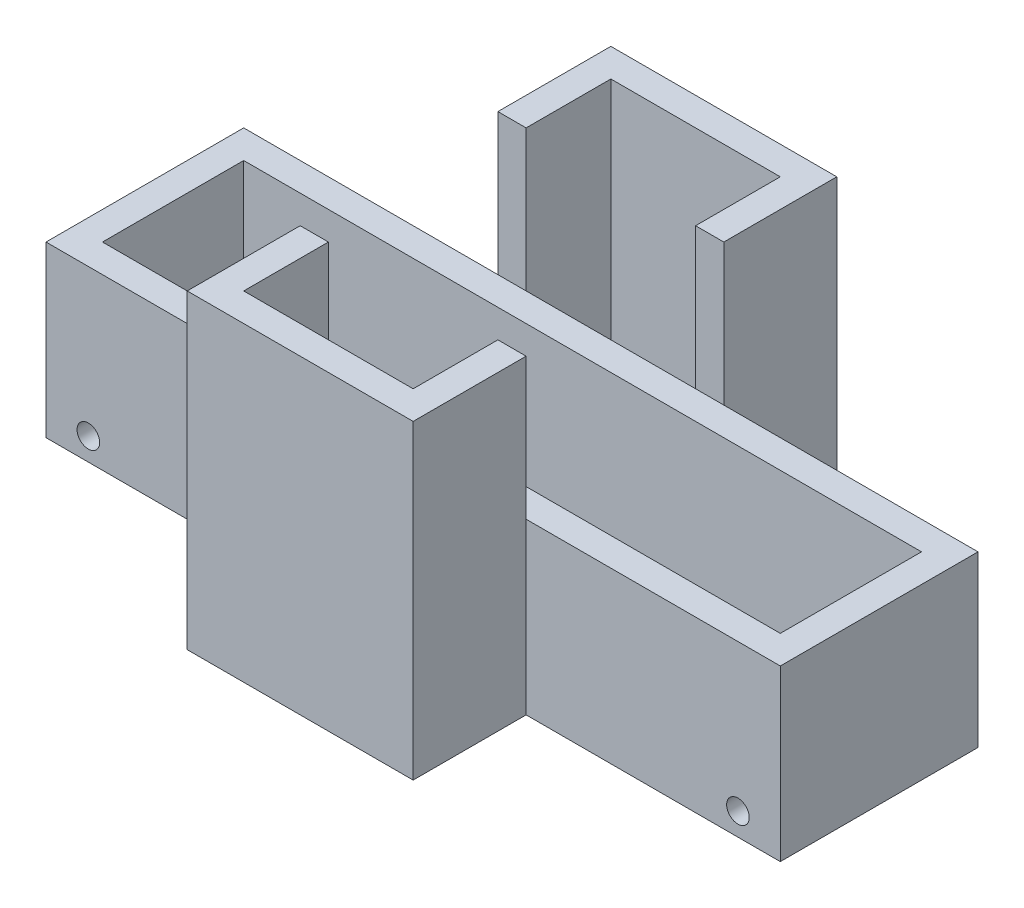
ISO-10303-21;
HEADER;
FILE_DESCRIPTION(('STEP AP214'),'2;1');
FILE_NAME('part.step','',(''),(''),'','','');
FILE_SCHEMA(('AUTOMOTIVE_DESIGN { 1 0 10303 214 1 1 1 1 }'));
ENDSEC;
DATA;
#1=APPLICATION_CONTEXT('core data for automotive mechanical design processes');
#2=APPLICATION_PROTOCOL_DEFINITION('international standard','automotive_design',2000,#1);
#3=PRODUCT_CONTEXT('',#1,'mechanical');
#4=PRODUCT('Part','Part','',(#3));
#5=PRODUCT_RELATED_PRODUCT_CATEGORY('part','',(#4));
#6=PRODUCT_DEFINITION_FORMATION('','',#4);
#7=PRODUCT_DEFINITION_CONTEXT('part definition',#1,'design');
#8=PRODUCT_DEFINITION('design','',#6,#7);
#9=PRODUCT_DEFINITION_SHAPE('','',#8);
#10=(LENGTH_UNIT() NAMED_UNIT(*) SI_UNIT(.MILLI.,.METRE.));
#11=(NAMED_UNIT(*) PLANE_ANGLE_UNIT() SI_UNIT($,.RADIAN.));
#12=(NAMED_UNIT(*) SI_UNIT($,.STERADIAN.) SOLID_ANGLE_UNIT());
#13=UNCERTAINTY_MEASURE_WITH_UNIT(LENGTH_MEASURE(1.E-05),#10,'distance_accuracy_value','');
#14=(GEOMETRIC_REPRESENTATION_CONTEXT(3) GLOBAL_UNCERTAINTY_ASSIGNED_CONTEXT((#13)) GLOBAL_UNIT_ASSIGNED_CONTEXT((#10,
#11,#12)) REPRESENTATION_CONTEXT('',''));
#15=CARTESIAN_POINT('',(0.,0.,0.));
#16=DIRECTION('',(0.,0.,1.));
#17=DIRECTION('',(1.,0.,0.));
#18=AXIS2_PLACEMENT_3D('',#15,#16,#17);
#19=CARTESIAN_POINT('',(0.,0.,17.5));
#20=DIRECTION('',(0.,0.,-1.));
#21=DIRECTION('',(-1.,0.,0.));
#22=AXIS2_PLACEMENT_3D('',#19,#20,#21);
#23=PLANE('',#22);
#24=DIRECTION('',(0.,1.,0.));
#25=VECTOR('',#24,1.);
#26=CARTESIAN_POINT('',(-15.,5.,17.5));
#27=LINE('',#26,#25);
#28=CARTESIAN_POINT('',(-15.,30.,17.5));
#29=VERTEX_POINT('',#28);
#30=CARTESIAN_POINT('',(-15.,55.,17.5));
#31=VERTEX_POINT('',#30);
#32=EDGE_CURVE('E283',#29,#31,#27,.T.);
#33=ORIENTED_EDGE('',*,*,#32,.F.);
#34=DIRECTION('',(1.,0.,0.));
#35=VECTOR('',#34,1.);
#36=CARTESIAN_POINT('',(-65.,30.,17.5));
#37=LINE('',#36,#35);
#38=CARTESIAN_POINT('',(-20.,30.,17.5));
#39=VERTEX_POINT('',#38);
#40=EDGE_CURVE('E463',#39,#29,#37,.T.);
#41=ORIENTED_EDGE('',*,*,#40,.F.);
#42=DIRECTION('',(0.,-1.,0.));
#43=VECTOR('',#42,1.);
#44=CARTESIAN_POINT('',(-20.,0.,17.5));
#45=LINE('',#44,#43);
#46=CARTESIAN_POINT('',(-20.,55.,17.5));
#47=VERTEX_POINT('',#46);
#48=EDGE_CURVE('E50',#47,#39,#45,.T.);
#49=ORIENTED_EDGE('',*,*,#48,.F.);
#50=DIRECTION('',(-1.,0.,0.));
#51=VECTOR('',#50,1.);
#52=CARTESIAN_POINT('',(-20.,55.,17.5));
#53=LINE('',#52,#51);
#54=EDGE_CURVE('E306',#31,#47,#53,.T.);
#55=ORIENTED_EDGE('',*,*,#54,.F.);
#56=EDGE_LOOP('',(#33,#41,#49,#55));
#57=FACE_BOUND('',#56,.T.);
#58=ADVANCED_FACE('F39',(#57),#23,.T.);
#59=CARTESIAN_POINT('',(-65.,30.,17.5));
#60=DIRECTION('',(0.,0.,-1.));
#61=DIRECTION('',(-1.,0.,0.));
#62=AXIS2_PLACEMENT_3D('',#59,#60,#61);
#63=PLANE('',#62);
#64=CARTESIAN_POINT('',(-57.5,4.,17.5));
#65=DIRECTION('',(0.,0.,1.));
#66=DIRECTION('',(1.,0.,0.));
#67=AXIS2_PLACEMENT_3D('',#64,#65,#66);
#68=CIRCLE('',#67,2.);
#69=CARTESIAN_POINT('',(-55.5,4.,17.5));
#70=VERTEX_POINT('',#69);
#71=EDGE_CURVE('E398',#70,#70,#68,.T.);
#72=ORIENTED_EDGE('',*,*,#71,.F.);
#73=EDGE_LOOP('',(#72));
#74=FACE_BOUND('',#73,.T.);
#75=CARTESIAN_POINT('',(-20.,0.,17.5));
#76=VERTEX_POINT('',#75);
#77=EDGE_CURVE('E11',#39,#76,#45,.T.);
#78=ORIENTED_EDGE('',*,*,#77,.F.);
#79=CARTESIAN_POINT('',(-65.,30.,17.5));
#80=VERTEX_POINT('',#79);
#81=EDGE_CURVE('E460',#80,#39,#37,.T.);
#82=ORIENTED_EDGE('',*,*,#81,.F.);
#83=DIRECTION('',(0.,-1.,0.));
#84=VECTOR('',#83,1.);
#85=CARTESIAN_POINT('',(-65.,30.,17.5));
#86=LINE('',#85,#84);
#87=CARTESIAN_POINT('',(-65.,0.,17.5));
#88=VERTEX_POINT('',#87);
#89=EDGE_CURVE('E476',#80,#88,#86,.T.);
#90=ORIENTED_EDGE('',*,*,#89,.T.);
#91=DIRECTION('',(1.,0.,0.));
#92=VECTOR('',#91,1.);
#93=CARTESIAN_POINT('',(-65.,0.,17.5));
#94=LINE('',#93,#92);
#95=EDGE_CURVE('E451',#88,#76,#94,.T.);
#96=ORIENTED_EDGE('',*,*,#95,.T.);
#97=EDGE_LOOP('',(#78,#82,#90,#96));
#98=FACE_BOUND('',#97,.T.);
#99=ADVANCED_FACE('F532',(#74,#98),#63,.F.);
#100=CARTESIAN_POINT('',(57.5,4.,17.5));
#101=DIRECTION('',(0.,0.,-1.));
#102=DIRECTION('',(-1.,0.,0.));
#103=AXIS2_PLACEMENT_3D('',#100,#101,#102);
#104=CIRCLE('',#103,2.);
#105=CARTESIAN_POINT('',(55.5,4.,17.5));
#106=VERTEX_POINT('',#105);
#107=EDGE_CURVE('E387',#106,#106,#104,.T.);
#108=ORIENTED_EDGE('',*,*,#107,.T.);
#109=EDGE_LOOP('',(#108));
#110=FACE_BOUND('',#109,.T.);
#111=DIRECTION('',(0.,1.,0.));
#112=VECTOR('',#111,1.);
#113=CARTESIAN_POINT('',(20.,0.,17.5));
#114=LINE('',#113,#112);
#115=CARTESIAN_POINT('',(20.,0.,17.5));
#116=VERTEX_POINT('',#115);
#117=CARTESIAN_POINT('',(20.,30.,17.5));
#118=VERTEX_POINT('',#117);
#119=EDGE_CURVE('E303',#116,#118,#114,.T.);
#120=ORIENTED_EDGE('',*,*,#119,.F.);
#121=CARTESIAN_POINT('',(65.,0.,17.5));
#122=VERTEX_POINT('',#121);
#123=EDGE_CURVE('E472',#116,#122,#94,.T.);
#124=ORIENTED_EDGE('',*,*,#123,.T.);
#125=DIRECTION('',(0.,-1.,0.));
#126=VECTOR('',#125,1.);
#127=CARTESIAN_POINT('',(65.,30.,17.5));
#128=LINE('',#127,#126);
#129=CARTESIAN_POINT('',(65.,30.,17.5));
#130=VERTEX_POINT('',#129);
#131=EDGE_CURVE('E462',#130,#122,#128,.T.);
#132=ORIENTED_EDGE('',*,*,#131,.F.);
#133=EDGE_CURVE('E459',#118,#130,#37,.T.);
#134=ORIENTED_EDGE('',*,*,#133,.F.);
#135=EDGE_LOOP('',(#120,#124,#132,#134));
#136=FACE_BOUND('',#135,.T.);
#137=ADVANCED_FACE('F577',(#110,#136),#63,.F.);
#138=CARTESIAN_POINT('',(0.,0.,-17.5));
#139=DIRECTION('',(0.,0.,1.));
#140=DIRECTION('',(1.,0.,0.));
#141=AXIS2_PLACEMENT_3D('',#138,#139,#140);
#142=PLANE('',#141);
#143=DIRECTION('',(0.,1.,0.));
#144=VECTOR('',#143,1.);
#145=CARTESIAN_POINT('',(-15.,5.,-17.5));
#146=LINE('',#145,#144);
#147=CARTESIAN_POINT('',(-15.,30.,-17.5));
#148=VERTEX_POINT('',#147);
#149=CARTESIAN_POINT('',(-15.,55.,-17.5));
#150=VERTEX_POINT('',#149);
#151=EDGE_CURVE('E334',#148,#150,#146,.T.);
#152=ORIENTED_EDGE('',*,*,#151,.T.);
#153=DIRECTION('',(1.,0.,0.));
#154=VECTOR('',#153,1.);
#155=CARTESIAN_POINT('',(20.,55.,-17.5));
#156=LINE('',#155,#154);
#157=CARTESIAN_POINT('',(-20.,55.,-17.5));
#158=VERTEX_POINT('',#157);
#159=EDGE_CURVE('E359',#158,#150,#156,.T.);
#160=ORIENTED_EDGE('',*,*,#159,.F.);
#161=DIRECTION('',(0.,1.,0.));
#162=VECTOR('',#161,1.);
#163=CARTESIAN_POINT('',(-20.,0.,-17.5));
#164=LINE('',#163,#162);
#165=CARTESIAN_POINT('',(-20.,30.,-17.5));
#166=VERTEX_POINT('',#165);
#167=EDGE_CURVE('E368',#166,#158,#164,.T.);
#168=ORIENTED_EDGE('',*,*,#167,.F.);
#169=DIRECTION('',(-1.,0.,0.));
#170=VECTOR('',#169,1.);
#171=CARTESIAN_POINT('',(-65.,30.,-17.5));
#172=LINE('',#171,#170);
#173=EDGE_CURVE('E457',#148,#166,#172,.T.);
#174=ORIENTED_EDGE('',*,*,#173,.F.);
#175=EDGE_LOOP('',(#152,#160,#168,#174));
#176=FACE_BOUND('',#175,.T.);
#177=ADVANCED_FACE('F619',(#176),#142,.T.);
#178=CARTESIAN_POINT('',(-65.,30.,-17.5));
#179=DIRECTION('',(0.,0.,1.));
#180=DIRECTION('',(1.,0.,0.));
#181=AXIS2_PLACEMENT_3D('',#178,#179,#180);
#182=PLANE('',#181);
#183=CARTESIAN_POINT('',(57.5,4.,-17.5));
#184=DIRECTION('',(0.,0.,-1.));
#185=DIRECTION('',(-1.,0.,0.));
#186=AXIS2_PLACEMENT_3D('',#183,#184,#185);
#187=CIRCLE('',#186,2.);
#188=CARTESIAN_POINT('',(55.5,4.,-17.5));
#189=VERTEX_POINT('',#188);
#190=EDGE_CURVE('E386',#189,#189,#187,.T.);
#191=ORIENTED_EDGE('',*,*,#190,.F.);
#192=EDGE_LOOP('',(#191));
#193=FACE_BOUND('',#192,.T.);
#194=DIRECTION('',(0.,-1.,0.));
#195=VECTOR('',#194,1.);
#196=CARTESIAN_POINT('',(20.,0.,-17.5));
#197=LINE('',#196,#195);
#198=CARTESIAN_POINT('',(20.,30.,-17.5));
#199=VERTEX_POINT('',#198);
#200=CARTESIAN_POINT('',(20.,0.,-17.5));
#201=VERTEX_POINT('',#200);
#202=EDGE_CURVE('E48',#199,#201,#197,.T.);
#203=ORIENTED_EDGE('',*,*,#202,.F.);
#204=CARTESIAN_POINT('',(65.,30.,-17.5));
#205=VERTEX_POINT('',#204);
#206=EDGE_CURVE('E452',#205,#199,#172,.T.);
#207=ORIENTED_EDGE('',*,*,#206,.F.);
#208=DIRECTION('',(0.,-1.,0.));
#209=VECTOR('',#208,1.);
#210=CARTESIAN_POINT('',(65.,30.,-17.5));
#211=LINE('',#210,#209);
#212=CARTESIAN_POINT('',(65.,0.,-17.5));
#213=VERTEX_POINT('',#212);
#214=EDGE_CURVE('E482',#205,#213,#211,.T.);
#215=ORIENTED_EDGE('',*,*,#214,.T.);
#216=DIRECTION('',(-1.,0.,0.));
#217=VECTOR('',#216,1.);
#218=CARTESIAN_POINT('',(-65.,0.,-17.5));
#219=LINE('',#218,#217);
#220=EDGE_CURVE('E468',#213,#201,#219,.T.);
#221=ORIENTED_EDGE('',*,*,#220,.T.);
#222=EDGE_LOOP('',(#203,#207,#215,#221));
#223=FACE_BOUND('',#222,.T.);
#224=ADVANCED_FACE('F661',(#193,#223),#182,.F.);
#225=CARTESIAN_POINT('',(-57.5,4.,-17.5));
#226=DIRECTION('',(0.,0.,1.));
#227=DIRECTION('',(1.,0.,0.));
#228=AXIS2_PLACEMENT_3D('',#225,#226,#227);
#229=CIRCLE('',#228,2.);
#230=CARTESIAN_POINT('',(-55.5,4.,-17.5));
#231=VERTEX_POINT('',#230);
#232=EDGE_CURVE('E399',#231,#231,#229,.T.);
#233=ORIENTED_EDGE('',*,*,#232,.T.);
#234=EDGE_LOOP('',(#233));
#235=FACE_BOUND('',#234,.T.);
#236=CARTESIAN_POINT('',(-20.,0.,-17.5));
#237=VERTEX_POINT('',#236);
#238=EDGE_CURVE('E369',#237,#166,#164,.T.);
#239=ORIENTED_EDGE('',*,*,#238,.F.);
#240=CARTESIAN_POINT('',(-65.,0.,-17.5));
#241=VERTEX_POINT('',#240);
#242=EDGE_CURVE('E467',#237,#241,#219,.T.);
#243=ORIENTED_EDGE('',*,*,#242,.T.);
#244=DIRECTION('',(0.,-1.,0.));
#245=VECTOR('',#244,1.);
#246=CARTESIAN_POINT('',(-65.,30.,-17.5));
#247=LINE('',#246,#245);
#248=CARTESIAN_POINT('',(-65.,30.,-17.5));
#249=VERTEX_POINT('',#248);
#250=EDGE_CURVE('E479',#249,#241,#247,.T.);
#251=ORIENTED_EDGE('',*,*,#250,.F.);
#252=EDGE_CURVE('E450',#166,#249,#172,.T.);
#253=ORIENTED_EDGE('',*,*,#252,.F.);
#254=EDGE_LOOP('',(#239,#243,#251,#253));
#255=FACE_BOUND('',#254,.T.);
#256=ADVANCED_FACE('F527',(#235,#255),#182,.F.);
#257=CARTESIAN_POINT('',(0.,5.,0.));
#258=DIRECTION('',(0.,1.,0.));
#259=DIRECTION('',(0.,0.,1.));
#260=AXIS2_PLACEMENT_3D('',#257,#258,#259);
#261=PLANE('',#260);
#262=DIRECTION('',(0.,0.,-1.));
#263=VECTOR('',#262,1.);
#264=CARTESIAN_POINT('',(59.2320508075689,5.,17.5));
#265=LINE('',#264,#263);
#266=CARTESIAN_POINT('',(59.2320508075689,5.,12.5));
#267=VERTEX_POINT('',#266);
#268=CARTESIAN_POINT('',(59.2320508075689,5.,-12.5));
#269=VERTEX_POINT('',#268);
#270=EDGE_CURVE('E43',#267,#269,#265,.T.);
#271=ORIENTED_EDGE('',*,*,#270,.F.);
#272=DIRECTION('',(1.,0.,0.));
#273=VECTOR('',#272,1.);
#274=CARTESIAN_POINT('',(-60.,5.,12.5));
#275=LINE('',#274,#273);
#276=CARTESIAN_POINT('',(60.,5.,12.5));
#277=VERTEX_POINT('',#276);
#278=EDGE_CURVE('E423',#267,#277,#275,.T.);
#279=ORIENTED_EDGE('',*,*,#278,.T.);
#280=DIRECTION('',(0.,0.,-1.));
#281=VECTOR('',#280,1.);
#282=CARTESIAN_POINT('',(60.,5.,-12.5));
#283=LINE('',#282,#281);
#284=CARTESIAN_POINT('',(60.,5.,-12.5));
#285=VERTEX_POINT('',#284);
#286=EDGE_CURVE('E411',#277,#285,#283,.T.);
#287=ORIENTED_EDGE('',*,*,#286,.T.);
#288=DIRECTION('',(-1.,0.,0.));
#289=VECTOR('',#288,1.);
#290=CARTESIAN_POINT('',(-60.,5.,-12.5));
#291=LINE('',#290,#289);
#292=EDGE_CURVE('E416',#285,#269,#291,.T.);
#293=ORIENTED_EDGE('',*,*,#292,.T.);
#294=EDGE_LOOP('',(#271,#279,#287,#293));
#295=FACE_BOUND('',#294,.T.);
#296=ADVANCED_FACE('F639',(#295),#261,.T.);
#297=DIRECTION('',(0.,0.,1.));
#298=VECTOR('',#297,1.);
#299=CARTESIAN_POINT('',(-59.2320508075689,5.,-17.5));
#300=LINE('',#299,#298);
#301=CARTESIAN_POINT('',(-59.2320508075689,5.,-12.5));
#302=VERTEX_POINT('',#301);
#303=CARTESIAN_POINT('',(-59.2320508075689,5.,12.5));
#304=VERTEX_POINT('',#303);
#305=EDGE_CURVE('E488',#302,#304,#300,.T.);
#306=ORIENTED_EDGE('',*,*,#305,.F.);
#307=CARTESIAN_POINT('',(-60.,5.,-12.5));
#308=VERTEX_POINT('',#307);
#309=EDGE_CURVE('E414',#302,#308,#291,.T.);
#310=ORIENTED_EDGE('',*,*,#309,.T.);
#311=DIRECTION('',(0.,0.,1.));
#312=VECTOR('',#311,1.);
#313=CARTESIAN_POINT('',(-60.,5.,-12.5));
#314=LINE('',#313,#312);
#315=CARTESIAN_POINT('',(-60.,5.,12.5));
#316=VERTEX_POINT('',#315);
#317=EDGE_CURVE('E419',#308,#316,#314,.T.);
#318=ORIENTED_EDGE('',*,*,#317,.T.);
#319=EDGE_CURVE('E424',#316,#304,#275,.T.);
#320=ORIENTED_EDGE('',*,*,#319,.T.);
#321=EDGE_LOOP('',(#306,#310,#318,#320));
#322=FACE_BOUND('',#321,.T.);
#323=ADVANCED_FACE('F640',(#322),#261,.T.);
#324=CARTESIAN_POINT('',(65.,30.,-17.5));
#325=DIRECTION('',(-1.,0.,0.));
#326=DIRECTION('',(0.,0.,1.));
#327=AXIS2_PLACEMENT_3D('',#324,#325,#326);
#328=PLANE('',#327);
#329=DIRECTION('',(0.,0.,-1.));
#330=VECTOR('',#329,1.);
#331=CARTESIAN_POINT('',(65.,0.,-17.5));
#332=LINE('',#331,#330);
#333=EDGE_CURVE('E440',#122,#213,#332,.T.);
#334=ORIENTED_EDGE('',*,*,#333,.T.);
#335=ORIENTED_EDGE('',*,*,#214,.F.);
#336=DIRECTION('',(0.,0.,-1.));
#337=VECTOR('',#336,1.);
#338=CARTESIAN_POINT('',(65.,30.,-17.5));
#339=LINE('',#338,#337);
#340=EDGE_CURVE('E447',#130,#205,#339,.T.);
#341=ORIENTED_EDGE('',*,*,#340,.F.);
#342=ORIENTED_EDGE('',*,*,#131,.T.);
#343=EDGE_LOOP('',(#334,#335,#341,#342));
#344=FACE_BOUND('',#343,.T.);
#345=ADVANCED_FACE('F41',(#344),#328,.F.);
#346=CARTESIAN_POINT('',(-65.,30.,-17.5));
#347=DIRECTION('',(1.,0.,0.));
#348=DIRECTION('',(0.,0.,-1.));
#349=AXIS2_PLACEMENT_3D('',#346,#347,#348);
#350=PLANE('',#349);
#351=DIRECTION('',(0.,0.,1.));
#352=VECTOR('',#351,1.);
#353=CARTESIAN_POINT('',(-65.,0.,-17.5));
#354=LINE('',#353,#352);
#355=EDGE_CURVE('E470',#241,#88,#354,.T.);
#356=ORIENTED_EDGE('',*,*,#355,.T.);
#357=ORIENTED_EDGE('',*,*,#89,.F.);
#358=DIRECTION('',(0.,0.,1.));
#359=VECTOR('',#358,1.);
#360=CARTESIAN_POINT('',(-65.,30.,-17.5));
#361=LINE('',#360,#359);
#362=EDGE_CURVE('E455',#249,#80,#361,.T.);
#363=ORIENTED_EDGE('',*,*,#362,.F.);
#364=ORIENTED_EDGE('',*,*,#250,.T.);
#365=EDGE_LOOP('',(#356,#357,#363,#364));
#366=FACE_BOUND('',#365,.T.);
#367=ADVANCED_FACE('F530',(#366),#350,.F.);
#368=CARTESIAN_POINT('',(0.,30.,0.));
#369=DIRECTION('',(0.,1.,0.));
#370=DIRECTION('',(0.,0.,1.));
#371=AXIS2_PLACEMENT_3D('',#368,#369,#370);
#372=PLANE('',#371);
#373=DIRECTION('',(0.,0.,-1.));
#374=VECTOR('',#373,1.);
#375=CARTESIAN_POINT('',(60.,30.,-12.5));
#376=LINE('',#375,#374);
#377=CARTESIAN_POINT('',(60.,30.,12.5));
#378=VERTEX_POINT('',#377);
#379=CARTESIAN_POINT('',(60.,30.,-12.5));
#380=VERTEX_POINT('',#379);
#381=EDGE_CURVE('E410',#378,#380,#376,.T.);
#382=ORIENTED_EDGE('',*,*,#381,.F.);
#383=DIRECTION('',(1.,0.,0.));
#384=VECTOR('',#383,1.);
#385=CARTESIAN_POINT('',(-60.,30.,12.5));
#386=LINE('',#385,#384);
#387=CARTESIAN_POINT('',(-60.,30.,12.5));
#388=VERTEX_POINT('',#387);
#389=EDGE_CURVE('E415',#388,#378,#386,.T.);
#390=ORIENTED_EDGE('',*,*,#389,.F.);
#391=DIRECTION('',(0.,0.,1.));
#392=VECTOR('',#391,1.);
#393=CARTESIAN_POINT('',(-60.,30.,-12.5));
#394=LINE('',#393,#392);
#395=CARTESIAN_POINT('',(-60.,30.,-12.5));
#396=VERTEX_POINT('',#395);
#397=EDGE_CURVE('E433',#396,#388,#394,.T.);
#398=ORIENTED_EDGE('',*,*,#397,.F.);
#399=DIRECTION('',(-1.,0.,0.));
#400=VECTOR('',#399,1.);
#401=CARTESIAN_POINT('',(-60.,30.,-12.5));
#402=LINE('',#401,#400);
#403=EDGE_CURVE('E430',#380,#396,#402,.T.);
#404=ORIENTED_EDGE('',*,*,#403,.F.);
#405=EDGE_LOOP('',(#382,#390,#398,#404));
#406=FACE_BOUND('',#405,.T.);
#407=ORIENTED_EDGE('',*,*,#340,.T.);
#408=ORIENTED_EDGE('',*,*,#206,.T.);
#409=CARTESIAN_POINT('',(15.,30.,-17.5));
#410=VERTEX_POINT('',#409);
#411=EDGE_CURVE('E456',#199,#410,#172,.T.);
#412=ORIENTED_EDGE('',*,*,#411,.T.);
#413=DIRECTION('',(1.,0.,0.));
#414=VECTOR('',#413,1.);
#415=CARTESIAN_POINT('',(0.,30.,-17.5));
#416=LINE('',#415,#414);
#417=EDGE_CURVE('E343',#148,#410,#416,.T.);
#418=ORIENTED_EDGE('',*,*,#417,.F.);
#419=ORIENTED_EDGE('',*,*,#173,.T.);
#420=ORIENTED_EDGE('',*,*,#252,.T.);
#421=ORIENTED_EDGE('',*,*,#362,.T.);
#422=ORIENTED_EDGE('',*,*,#81,.T.);
#423=ORIENTED_EDGE('',*,*,#40,.T.);
#424=DIRECTION('',(-1.,0.,0.));
#425=VECTOR('',#424,1.);
#426=CARTESIAN_POINT('',(0.,30.,17.5));
#427=LINE('',#426,#425);
#428=CARTESIAN_POINT('',(15.,30.,17.5));
#429=VERTEX_POINT('',#428);
#430=EDGE_CURVE('E282',#429,#29,#427,.T.);
#431=ORIENTED_EDGE('',*,*,#430,.F.);
#432=EDGE_CURVE('E464',#429,#118,#37,.T.);
#433=ORIENTED_EDGE('',*,*,#432,.T.);
#434=ORIENTED_EDGE('',*,*,#133,.T.);
#435=EDGE_LOOP('',(#407,#408,#412,#418,#419,#420,#421,#422,#423,#431,#433,#434));
#436=FACE_BOUND('',#435,.T.);
#437=ADVANCED_FACE('F521',(#406,#436),#372,.T.);
#438=CARTESIAN_POINT('',(0.,0.,0.));
#439=DIRECTION('',(0.,1.,0.));
#440=DIRECTION('',(0.,0.,1.));
#441=AXIS2_PLACEMENT_3D('',#438,#439,#440);
#442=PLANE('',#441);
#443=ORIENTED_EDGE('',*,*,#333,.F.);
#444=ORIENTED_EDGE('',*,*,#123,.F.);
#445=DIRECTION('',(0.,0.,-1.));
#446=VECTOR('',#445,1.);
#447=CARTESIAN_POINT('',(20.,0.,37.5));
#448=LINE('',#447,#446);
#449=CARTESIAN_POINT('',(20.,0.,37.5));
#450=VERTEX_POINT('',#449);
#451=EDGE_CURVE('E314',#450,#116,#448,.T.);
#452=ORIENTED_EDGE('',*,*,#451,.F.);
#453=DIRECTION('',(1.,0.,0.));
#454=VECTOR('',#453,1.);
#455=CARTESIAN_POINT('',(-20.,0.,37.5));
#456=LINE('',#455,#454);
#457=CARTESIAN_POINT('',(-20.,0.,37.5));
#458=VERTEX_POINT('',#457);
#459=EDGE_CURVE('E293',#458,#450,#456,.T.);
#460=ORIENTED_EDGE('',*,*,#459,.F.);
#461=DIRECTION('',(0.,0.,-1.));
#462=VECTOR('',#461,1.);
#463=CARTESIAN_POINT('',(-20.,0.,37.5));
#464=LINE('',#463,#462);
#465=EDGE_CURVE('E317',#458,#76,#464,.T.);
#466=ORIENTED_EDGE('',*,*,#465,.T.);
#467=ORIENTED_EDGE('',*,*,#95,.F.);
#468=ORIENTED_EDGE('',*,*,#355,.F.);
#469=ORIENTED_EDGE('',*,*,#242,.F.);
#470=DIRECTION('',(0.,0.,1.));
#471=VECTOR('',#470,1.);
#472=CARTESIAN_POINT('',(-20.,0.,-37.5));
#473=LINE('',#472,#471);
#474=CARTESIAN_POINT('',(-20.,0.,-37.5));
#475=VERTEX_POINT('',#474);
#476=EDGE_CURVE('E380',#475,#237,#473,.T.);
#477=ORIENTED_EDGE('',*,*,#476,.F.);
#478=DIRECTION('',(-1.,0.,0.));
#479=VECTOR('',#478,1.);
#480=CARTESIAN_POINT('',(20.,0.,-37.5));
#481=LINE('',#480,#479);
#482=CARTESIAN_POINT('',(20.,0.,-37.5));
#483=VERTEX_POINT('',#482);
#484=EDGE_CURVE('E358',#483,#475,#481,.T.);
#485=ORIENTED_EDGE('',*,*,#484,.F.);
#486=DIRECTION('',(0.,0.,1.));
#487=VECTOR('',#486,1.);
#488=CARTESIAN_POINT('',(20.,0.,-37.5));
#489=LINE('',#488,#487);
#490=EDGE_CURVE('E383',#483,#201,#489,.T.);
#491=ORIENTED_EDGE('',*,*,#490,.T.);
#492=ORIENTED_EDGE('',*,*,#220,.F.);
#493=EDGE_LOOP('',(#443,#444,#452,#460,#466,#467,#468,#469,#477,#485,#491,#492));
#494=FACE_BOUND('',#493,.T.);
#495=ADVANCED_FACE('F502',(#494),#442,.F.);
#496=CARTESIAN_POINT('',(60.,5.,-12.5));
#497=DIRECTION('',(1.,0.,0.));
#498=DIRECTION('',(0.,0.,-1.));
#499=AXIS2_PLACEMENT_3D('',#496,#497,#498);
#500=PLANE('',#499);
#501=ORIENTED_EDGE('',*,*,#381,.T.);
#502=DIRECTION('',(0.,1.,0.));
#503=VECTOR('',#502,1.);
#504=CARTESIAN_POINT('',(60.,5.,-12.5));
#505=LINE('',#504,#503);
#506=EDGE_CURVE('E427',#285,#380,#505,.T.);
#507=ORIENTED_EDGE('',*,*,#506,.F.);
#508=ORIENTED_EDGE('',*,*,#286,.F.);
#509=DIRECTION('',(0.,1.,0.));
#510=VECTOR('',#509,1.);
#511=CARTESIAN_POINT('',(60.,5.,12.5));
#512=LINE('',#511,#510);
#513=EDGE_CURVE('E438',#277,#378,#512,.T.);
#514=ORIENTED_EDGE('',*,*,#513,.T.);
#515=EDGE_LOOP('',(#501,#507,#508,#514));
#516=FACE_BOUND('',#515,.T.);
#517=ADVANCED_FACE('F645',(#516),#500,.F.);
#518=CARTESIAN_POINT('',(-60.,5.,12.5));
#519=DIRECTION('',(0.,0.,1.));
#520=DIRECTION('',(1.,0.,0.));
#521=AXIS2_PLACEMENT_3D('',#518,#519,#520);
#522=PLANE('',#521);
#523=ORIENTED_EDGE('',*,*,#278,.F.);
#524=CARTESIAN_POINT('',(57.5,4.,12.5));
#525=DIRECTION('',(0.,0.,1.));
#526=DIRECTION('',(1.,0.,0.));
#527=AXIS2_PLACEMENT_3D('',#524,#525,#526);
#528=CIRCLE('',#527,2.);
#529=CARTESIAN_POINT('',(55.7679491924311,5.,12.5));
#530=VERTEX_POINT('',#529);
#531=EDGE_CURVE('E395',#267,#530,#528,.T.);
#532=ORIENTED_EDGE('',*,*,#531,.T.);
#533=CARTESIAN_POINT('',(-55.7679491924311,5.,12.5));
#534=VERTEX_POINT('',#533);
#535=EDGE_CURVE('E428',#534,#530,#275,.T.);
#536=ORIENTED_EDGE('',*,*,#535,.F.);
#537=CARTESIAN_POINT('',(-57.5,4.,12.5));
#538=DIRECTION('',(0.,0.,1.));
#539=DIRECTION('',(1.,0.,0.));
#540=AXIS2_PLACEMENT_3D('',#537,#538,#539);
#541=CIRCLE('',#540,2.);
#542=EDGE_CURVE('E407',#534,#304,#541,.T.);
#543=ORIENTED_EDGE('',*,*,#542,.T.);
#544=ORIENTED_EDGE('',*,*,#319,.F.);
#545=DIRECTION('',(0.,1.,0.));
#546=VECTOR('',#545,1.);
#547=CARTESIAN_POINT('',(-60.,5.,12.5));
#548=LINE('',#547,#546);
#549=EDGE_CURVE('E441',#316,#388,#548,.T.);
#550=ORIENTED_EDGE('',*,*,#549,.T.);
#551=ORIENTED_EDGE('',*,*,#389,.T.);
#552=ORIENTED_EDGE('',*,*,#513,.F.);
#553=EDGE_LOOP('',(#523,#532,#536,#543,#544,#550,#551,#552));
#554=FACE_BOUND('',#553,.T.);
#555=ADVANCED_FACE('F641',(#554),#522,.F.);
#556=CARTESIAN_POINT('',(-60.,5.,-12.5));
#557=DIRECTION('',(-1.,0.,0.));
#558=DIRECTION('',(0.,0.,1.));
#559=AXIS2_PLACEMENT_3D('',#556,#557,#558);
#560=PLANE('',#559);
#561=ORIENTED_EDGE('',*,*,#397,.T.);
#562=ORIENTED_EDGE('',*,*,#549,.F.);
#563=ORIENTED_EDGE('',*,*,#317,.F.);
#564=DIRECTION('',(0.,1.,0.));
#565=VECTOR('',#564,1.);
#566=CARTESIAN_POINT('',(-60.,5.,-12.5));
#567=LINE('',#566,#565);
#568=EDGE_CURVE('E443',#308,#396,#567,.T.);
#569=ORIENTED_EDGE('',*,*,#568,.T.);
#570=EDGE_LOOP('',(#561,#562,#563,#569));
#571=FACE_BOUND('',#570,.T.);
#572=ADVANCED_FACE('F644',(#571),#560,.F.);
#573=CARTESIAN_POINT('',(-60.,5.,-12.5));
#574=DIRECTION('',(0.,0.,-1.));
#575=DIRECTION('',(-1.,0.,0.));
#576=AXIS2_PLACEMENT_3D('',#573,#574,#575);
#577=PLANE('',#576);
#578=CARTESIAN_POINT('',(55.7679491924311,5.,-12.5));
#579=VERTEX_POINT('',#578);
#580=CARTESIAN_POINT('',(-55.7679491924311,5.,-12.5));
#581=VERTEX_POINT('',#580);
#582=EDGE_CURVE('E420',#579,#581,#291,.T.);
#583=ORIENTED_EDGE('',*,*,#582,.F.);
#584=CARTESIAN_POINT('',(57.5,4.,-12.5));
#585=DIRECTION('',(0.,0.,-1.));
#586=DIRECTION('',(-1.,0.,0.));
#587=AXIS2_PLACEMENT_3D('',#584,#585,#586);
#588=CIRCLE('',#587,2.);
#589=EDGE_CURVE('E390',#579,#269,#588,.T.);
#590=ORIENTED_EDGE('',*,*,#589,.T.);
#591=ORIENTED_EDGE('',*,*,#292,.F.);
#592=ORIENTED_EDGE('',*,*,#506,.T.);
#593=ORIENTED_EDGE('',*,*,#403,.T.);
#594=ORIENTED_EDGE('',*,*,#568,.F.);
#595=ORIENTED_EDGE('',*,*,#309,.F.);
#596=CARTESIAN_POINT('',(-57.5,4.,-12.5));
#597=DIRECTION('',(0.,0.,-1.));
#598=DIRECTION('',(-1.,0.,0.));
#599=AXIS2_PLACEMENT_3D('',#596,#597,#598);
#600=CIRCLE('',#599,2.);
#601=EDGE_CURVE('E402',#302,#581,#600,.T.);
#602=ORIENTED_EDGE('',*,*,#601,.T.);
#603=EDGE_LOOP('',(#583,#590,#591,#592,#593,#594,#595,#602));
#604=FACE_BOUND('',#603,.T.);
#605=ADVANCED_FACE('F637',(#604),#577,.F.);
#606=DIRECTION('',(0.,0.,-1.));
#607=VECTOR('',#606,1.);
#608=CARTESIAN_POINT('',(55.7679491924311,5.,17.5));
#609=LINE('',#608,#607);
#610=EDGE_CURVE('E489',#579,#530,#609,.F.);
#611=ORIENTED_EDGE('',*,*,#610,.F.);
#612=ORIENTED_EDGE('',*,*,#582,.T.);
#613=DIRECTION('',(0.,0.,1.));
#614=VECTOR('',#613,1.);
#615=CARTESIAN_POINT('',(-55.7679491924311,5.,-17.5));
#616=LINE('',#615,#614);
#617=EDGE_CURVE('E485',#534,#581,#616,.F.);
#618=ORIENTED_EDGE('',*,*,#617,.F.);
#619=ORIENTED_EDGE('',*,*,#535,.T.);
#620=EDGE_LOOP('',(#611,#612,#618,#619));
#621=FACE_BOUND('',#620,.T.);
#622=ADVANCED_FACE('F633',(#621),#261,.T.);
#623=CARTESIAN_POINT('',(-57.5,4.,-17.5));
#624=DIRECTION('',(0.,0.,1.));
#625=DIRECTION('',(1.,0.,0.));
#626=AXIS2_PLACEMENT_3D('',#623,#624,#625);
#627=CYLINDRICAL_SURFACE('',#626,2.);
#628=ORIENTED_EDGE('',*,*,#305,.T.);
#629=ORIENTED_EDGE('',*,*,#542,.F.);
#630=ORIENTED_EDGE('',*,*,#617,.T.);
#631=ORIENTED_EDGE('',*,*,#601,.F.);
#632=EDGE_LOOP('',(#628,#629,#630,#631));
#633=FACE_BOUND('',#632,.T.);
#634=ORIENTED_EDGE('',*,*,#232,.F.);
#635=EDGE_LOOP('',(#634));
#636=FACE_BOUND('',#635,.T.);
#637=ORIENTED_EDGE('',*,*,#71,.T.);
#638=EDGE_LOOP('',(#637));
#639=FACE_BOUND('',#638,.T.);
#640=ADVANCED_FACE('F630',(#633,#636,#639),#627,.F.);
#641=CARTESIAN_POINT('',(57.5,4.,17.5));
#642=DIRECTION('',(0.,0.,-1.));
#643=DIRECTION('',(-1.,0.,0.));
#644=AXIS2_PLACEMENT_3D('',#641,#642,#643);
#645=CYLINDRICAL_SURFACE('',#644,2.);
#646=ORIENTED_EDGE('',*,*,#270,.T.);
#647=ORIENTED_EDGE('',*,*,#589,.F.);
#648=ORIENTED_EDGE('',*,*,#610,.T.);
#649=ORIENTED_EDGE('',*,*,#531,.F.);
#650=EDGE_LOOP('',(#646,#647,#648,#649));
#651=FACE_BOUND('',#650,.T.);
#652=ORIENTED_EDGE('',*,*,#107,.F.);
#653=EDGE_LOOP('',(#652));
#654=FACE_BOUND('',#653,.T.);
#655=ORIENTED_EDGE('',*,*,#190,.T.);
#656=EDGE_LOOP('',(#655));
#657=FACE_BOUND('',#656,.T.);
#658=ADVANCED_FACE('F618',(#651,#654,#657),#645,.F.);
#659=DIRECTION('',(0.,1.,0.));
#660=VECTOR('',#659,1.);
#661=CARTESIAN_POINT('',(15.,5.,-17.5));
#662=LINE('',#661,#660);
#663=CARTESIAN_POINT('',(15.,55.,-17.5));
#664=VERTEX_POINT('',#663);
#665=EDGE_CURVE('E349',#410,#664,#662,.T.);
#666=ORIENTED_EDGE('',*,*,#665,.F.);
#667=ORIENTED_EDGE('',*,*,#411,.F.);
#668=CARTESIAN_POINT('',(20.,55.,-17.5));
#669=VERTEX_POINT('',#668);
#670=EDGE_CURVE('E354',#669,#199,#197,.T.);
#671=ORIENTED_EDGE('',*,*,#670,.F.);
#672=EDGE_CURVE('E372',#664,#669,#156,.T.);
#673=ORIENTED_EDGE('',*,*,#672,.F.);
#674=EDGE_LOOP('',(#666,#667,#671,#673));
#675=FACE_BOUND('',#674,.T.);
#676=ADVANCED_FACE('F515',(#675),#142,.T.);
#677=CARTESIAN_POINT('',(20.,0.,-37.5));
#678=DIRECTION('',(-1.,0.,0.));
#679=DIRECTION('',(0.,0.,1.));
#680=AXIS2_PLACEMENT_3D('',#677,#678,#679);
#681=PLANE('',#680);
#682=ORIENTED_EDGE('',*,*,#670,.T.);
#683=ORIENTED_EDGE('',*,*,#202,.T.);
#684=ORIENTED_EDGE('',*,*,#490,.F.);
#685=DIRECTION('',(0.,-1.,0.));
#686=VECTOR('',#685,1.);
#687=CARTESIAN_POINT('',(20.,0.,-37.5));
#688=LINE('',#687,#686);
#689=CARTESIAN_POINT('',(20.,55.,-37.5));
#690=VERTEX_POINT('',#689);
#691=EDGE_CURVE('E355',#690,#483,#688,.T.);
#692=ORIENTED_EDGE('',*,*,#691,.F.);
#693=DIRECTION('',(0.,0.,1.));
#694=VECTOR('',#693,1.);
#695=CARTESIAN_POINT('',(20.,55.,-37.5));
#696=LINE('',#695,#694);
#697=EDGE_CURVE('E365',#690,#669,#696,.T.);
#698=ORIENTED_EDGE('',*,*,#697,.T.);
#699=EDGE_LOOP('',(#682,#683,#684,#692,#698));
#700=FACE_BOUND('',#699,.T.);
#701=ADVANCED_FACE('F496',(#700),#681,.F.);
#702=CARTESIAN_POINT('',(-20.,0.,-37.5));
#703=DIRECTION('',(1.,0.,0.));
#704=DIRECTION('',(0.,0.,-1.));
#705=AXIS2_PLACEMENT_3D('',#702,#703,#704);
#706=PLANE('',#705);
#707=ORIENTED_EDGE('',*,*,#238,.T.);
#708=ORIENTED_EDGE('',*,*,#167,.T.);
#709=DIRECTION('',(0.,0.,1.));
#710=VECTOR('',#709,1.);
#711=CARTESIAN_POINT('',(-20.,55.,-37.5));
#712=LINE('',#711,#710);
#713=CARTESIAN_POINT('',(-20.,55.,-37.5));
#714=VERTEX_POINT('',#713);
#715=EDGE_CURVE('E377',#714,#158,#712,.T.);
#716=ORIENTED_EDGE('',*,*,#715,.F.);
#717=DIRECTION('',(0.,1.,0.));
#718=VECTOR('',#717,1.);
#719=CARTESIAN_POINT('',(-20.,0.,-37.5));
#720=LINE('',#719,#718);
#721=EDGE_CURVE('E361',#475,#714,#720,.T.);
#722=ORIENTED_EDGE('',*,*,#721,.F.);
#723=ORIENTED_EDGE('',*,*,#476,.T.);
#724=EDGE_LOOP('',(#707,#708,#716,#722,#723));
#725=FACE_BOUND('',#724,.T.);
#726=ADVANCED_FACE('F622',(#725),#706,.F.);
#727=CARTESIAN_POINT('',(20.,55.,-37.5));
#728=DIRECTION('',(0.,-1.,0.));
#729=DIRECTION('',(0.,0.,-1.));
#730=AXIS2_PLACEMENT_3D('',#727,#728,#729);
#731=PLANE('',#730);
#732=ORIENTED_EDGE('',*,*,#159,.T.);
#733=DIRECTION('',(0.,0.,1.));
#734=VECTOR('',#733,1.);
#735=CARTESIAN_POINT('',(-15.,55.,-17.5));
#736=LINE('',#735,#734);
#737=CARTESIAN_POINT('',(-15.,55.,-32.5));
#738=VERTEX_POINT('',#737);
#739=EDGE_CURVE('E320',#738,#150,#736,.T.);
#740=ORIENTED_EDGE('',*,*,#739,.F.);
#741=DIRECTION('',(-1.,0.,0.));
#742=VECTOR('',#741,1.);
#743=CARTESIAN_POINT('',(-15.,55.,-32.5));
#744=LINE('',#743,#742);
#745=CARTESIAN_POINT('',(15.,55.,-32.5));
#746=VERTEX_POINT('',#745);
#747=EDGE_CURVE('E325',#746,#738,#744,.T.);
#748=ORIENTED_EDGE('',*,*,#747,.F.);
#749=DIRECTION('',(0.,0.,-1.));
#750=VECTOR('',#749,1.);
#751=CARTESIAN_POINT('',(15.,55.,-17.5));
#752=LINE('',#751,#750);
#753=EDGE_CURVE('E336',#664,#746,#752,.T.);
#754=ORIENTED_EDGE('',*,*,#753,.F.);
#755=ORIENTED_EDGE('',*,*,#672,.T.);
#756=ORIENTED_EDGE('',*,*,#697,.F.);
#757=DIRECTION('',(1.,0.,0.));
#758=VECTOR('',#757,1.);
#759=CARTESIAN_POINT('',(20.,55.,-37.5));
#760=LINE('',#759,#758);
#761=EDGE_CURVE('E363',#714,#690,#760,.T.);
#762=ORIENTED_EDGE('',*,*,#761,.F.);
#763=ORIENTED_EDGE('',*,*,#715,.T.);
#764=EDGE_LOOP('',(#732,#740,#748,#754,#755,#756,#762,#763));
#765=FACE_BOUND('',#764,.T.);
#766=ADVANCED_FACE('F615',(#765),#731,.F.);
#767=CARTESIAN_POINT('',(0.,0.,-37.5));
#768=DIRECTION('',(0.,0.,1.));
#769=DIRECTION('',(1.,0.,0.));
#770=AXIS2_PLACEMENT_3D('',#767,#768,#769);
#771=PLANE('',#770);
#772=ORIENTED_EDGE('',*,*,#691,.T.);
#773=ORIENTED_EDGE('',*,*,#484,.T.);
#774=ORIENTED_EDGE('',*,*,#721,.T.);
#775=ORIENTED_EDGE('',*,*,#761,.T.);
#776=EDGE_LOOP('',(#772,#773,#774,#775));
#777=FACE_BOUND('',#776,.T.);
#778=ADVANCED_FACE('F507',(#777),#771,.F.);
#779=CARTESIAN_POINT('',(-15.,5.,-17.5));
#780=DIRECTION('',(-1.,0.,0.));
#781=DIRECTION('',(0.,0.,1.));
#782=AXIS2_PLACEMENT_3D('',#779,#780,#781);
#783=PLANE('',#782);
#784=ORIENTED_EDGE('',*,*,#739,.T.);
#785=ORIENTED_EDGE('',*,*,#151,.F.);
#786=CARTESIAN_POINT('',(-15.,5.,-17.5));
#787=VERTEX_POINT('',#786);
#788=EDGE_CURVE('E350',#787,#148,#146,.T.);
#789=ORIENTED_EDGE('',*,*,#788,.F.);
#790=DIRECTION('',(0.,0.,1.));
#791=VECTOR('',#790,1.);
#792=CARTESIAN_POINT('',(-15.,5.,-17.5));
#793=LINE('',#792,#791);
#794=CARTESIAN_POINT('',(-15.,5.,-32.5));
#795=VERTEX_POINT('',#794);
#796=EDGE_CURVE('E321',#795,#787,#793,.T.);
#797=ORIENTED_EDGE('',*,*,#796,.F.);
#798=DIRECTION('',(0.,1.,0.));
#799=VECTOR('',#798,1.);
#800=CARTESIAN_POINT('',(-15.,5.,-32.5));
#801=LINE('',#800,#799);
#802=EDGE_CURVE('E341',#795,#738,#801,.T.);
#803=ORIENTED_EDGE('',*,*,#802,.T.);
#804=EDGE_LOOP('',(#784,#785,#789,#797,#803));
#805=FACE_BOUND('',#804,.T.);
#806=ADVANCED_FACE('F605',(#805),#783,.F.);
#807=CARTESIAN_POINT('',(-15.,5.,-32.5));
#808=DIRECTION('',(0.,0.,-1.));
#809=DIRECTION('',(-1.,0.,0.));
#810=AXIS2_PLACEMENT_3D('',#807,#808,#809);
#811=PLANE('',#810);
#812=ORIENTED_EDGE('',*,*,#747,.T.);
#813=ORIENTED_EDGE('',*,*,#802,.F.);
#814=DIRECTION('',(-1.,0.,0.));
#815=VECTOR('',#814,1.);
#816=CARTESIAN_POINT('',(-15.,5.,-32.5));
#817=LINE('',#816,#815);
#818=CARTESIAN_POINT('',(15.,5.,-32.5));
#819=VERTEX_POINT('',#818);
#820=EDGE_CURVE('E331',#819,#795,#817,.T.);
#821=ORIENTED_EDGE('',*,*,#820,.F.);
#822=DIRECTION('',(0.,1.,0.));
#823=VECTOR('',#822,1.);
#824=CARTESIAN_POINT('',(15.,5.,-32.5));
#825=LINE('',#824,#823);
#826=EDGE_CURVE('E344',#819,#746,#825,.T.);
#827=ORIENTED_EDGE('',*,*,#826,.T.);
#828=EDGE_LOOP('',(#812,#813,#821,#827));
#829=FACE_BOUND('',#828,.T.);
#830=ADVANCED_FACE('F602',(#829),#811,.F.);
#831=CARTESIAN_POINT('',(15.,5.,-17.5));
#832=DIRECTION('',(1.,0.,0.));
#833=DIRECTION('',(0.,0.,-1.));
#834=AXIS2_PLACEMENT_3D('',#831,#832,#833);
#835=PLANE('',#834);
#836=ORIENTED_EDGE('',*,*,#753,.T.);
#837=ORIENTED_EDGE('',*,*,#826,.F.);
#838=DIRECTION('',(0.,0.,-1.));
#839=VECTOR('',#838,1.);
#840=CARTESIAN_POINT('',(15.,5.,-17.5));
#841=LINE('',#840,#839);
#842=CARTESIAN_POINT('',(15.,5.,-17.5));
#843=VERTEX_POINT('',#842);
#844=EDGE_CURVE('E328',#843,#819,#841,.T.);
#845=ORIENTED_EDGE('',*,*,#844,.F.);
#846=EDGE_CURVE('E346',#843,#410,#662,.T.);
#847=ORIENTED_EDGE('',*,*,#846,.T.);
#848=ORIENTED_EDGE('',*,*,#665,.T.);
#849=EDGE_LOOP('',(#836,#837,#845,#847,#848));
#850=FACE_BOUND('',#849,.T.);
#851=ADVANCED_FACE('F597',(#850),#835,.F.);
#852=CARTESIAN_POINT('',(-15.,5.,-17.5));
#853=DIRECTION('',(0.,0.,1.));
#854=DIRECTION('',(1.,0.,0.));
#855=AXIS2_PLACEMENT_3D('',#852,#853,#854);
#856=PLANE('',#855);
#857=ORIENTED_EDGE('',*,*,#417,.T.);
#858=ORIENTED_EDGE('',*,*,#846,.F.);
#859=DIRECTION('',(1.,0.,0.));
#860=VECTOR('',#859,1.);
#861=CARTESIAN_POINT('',(-15.,5.,-17.5));
#862=LINE('',#861,#860);
#863=EDGE_CURVE('E324',#787,#843,#862,.T.);
#864=ORIENTED_EDGE('',*,*,#863,.F.);
#865=ORIENTED_EDGE('',*,*,#788,.T.);
#866=EDGE_LOOP('',(#857,#858,#864,#865));
#867=FACE_BOUND('',#866,.T.);
#868=ADVANCED_FACE('F591',(#867),#856,.F.);
#869=CARTESIAN_POINT('',(0.,5.,0.));
#870=DIRECTION('',(0.,-1.,0.));
#871=DIRECTION('',(0.,0.,-1.));
#872=AXIS2_PLACEMENT_3D('',#869,#870,#871);
#873=PLANE('',#872);
#874=ORIENTED_EDGE('',*,*,#796,.T.);
#875=ORIENTED_EDGE('',*,*,#863,.T.);
#876=ORIENTED_EDGE('',*,*,#844,.T.);
#877=ORIENTED_EDGE('',*,*,#820,.T.);
#878=EDGE_LOOP('',(#874,#875,#876,#877));
#879=FACE_BOUND('',#878,.T.);
#880=ADVANCED_FACE('F583',(#879),#873,.F.);
#881=DIRECTION('',(0.,1.,0.));
#882=VECTOR('',#881,1.);
#883=CARTESIAN_POINT('',(15.,5.,17.5));
#884=LINE('',#883,#882);
#885=CARTESIAN_POINT('',(15.,55.,17.5));
#886=VERTEX_POINT('',#885);
#887=EDGE_CURVE('E287',#429,#886,#884,.T.);
#888=ORIENTED_EDGE('',*,*,#887,.T.);
#889=CARTESIAN_POINT('',(20.,55.,17.5));
#890=VERTEX_POINT('',#889);
#891=EDGE_CURVE('E294',#890,#886,#53,.T.);
#892=ORIENTED_EDGE('',*,*,#891,.F.);
#893=EDGE_CURVE('E302',#118,#890,#114,.T.);
#894=ORIENTED_EDGE('',*,*,#893,.F.);
#895=ORIENTED_EDGE('',*,*,#432,.F.);
#896=EDGE_LOOP('',(#888,#892,#894,#895));
#897=FACE_BOUND('',#896,.T.);
#898=ADVANCED_FACE('F555',(#897),#23,.T.);
#899=CARTESIAN_POINT('',(-20.,0.,37.5));
#900=DIRECTION('',(1.,0.,0.));
#901=DIRECTION('',(0.,0.,-1.));
#902=AXIS2_PLACEMENT_3D('',#899,#900,#901);
#903=PLANE('',#902);
#904=ORIENTED_EDGE('',*,*,#48,.T.);
#905=ORIENTED_EDGE('',*,*,#77,.T.);
#906=ORIENTED_EDGE('',*,*,#465,.F.);
#907=DIRECTION('',(0.,-1.,0.));
#908=VECTOR('',#907,1.);
#909=CARTESIAN_POINT('',(-20.,0.,37.5));
#910=LINE('',#909,#908);
#911=CARTESIAN_POINT('',(-20.,55.,37.5));
#912=VERTEX_POINT('',#911);
#913=EDGE_CURVE('E290',#912,#458,#910,.T.);
#914=ORIENTED_EDGE('',*,*,#913,.F.);
#915=DIRECTION('',(0.,0.,-1.));
#916=VECTOR('',#915,1.);
#917=CARTESIAN_POINT('',(-20.,55.,37.5));
#918=LINE('',#917,#916);
#919=EDGE_CURVE('E299',#912,#47,#918,.T.);
#920=ORIENTED_EDGE('',*,*,#919,.T.);
#921=EDGE_LOOP('',(#904,#905,#906,#914,#920));
#922=FACE_BOUND('',#921,.T.);
#923=ADVANCED_FACE('F541',(#922),#903,.F.);
#924=CARTESIAN_POINT('',(20.,0.,37.5));
#925=DIRECTION('',(-1.,0.,0.));
#926=DIRECTION('',(0.,0.,1.));
#927=AXIS2_PLACEMENT_3D('',#924,#925,#926);
#928=PLANE('',#927);
#929=ORIENTED_EDGE('',*,*,#119,.T.);
#930=ORIENTED_EDGE('',*,*,#893,.T.);
#931=DIRECTION('',(0.,0.,-1.));
#932=VECTOR('',#931,1.);
#933=CARTESIAN_POINT('',(20.,55.,37.5));
#934=LINE('',#933,#932);
#935=CARTESIAN_POINT('',(20.,55.,37.5));
#936=VERTEX_POINT('',#935);
#937=EDGE_CURVE('E311',#936,#890,#934,.T.);
#938=ORIENTED_EDGE('',*,*,#937,.F.);
#939=DIRECTION('',(0.,1.,0.));
#940=VECTOR('',#939,1.);
#941=CARTESIAN_POINT('',(20.,0.,37.5));
#942=LINE('',#941,#940);
#943=EDGE_CURVE('E296',#450,#936,#942,.T.);
#944=ORIENTED_EDGE('',*,*,#943,.F.);
#945=ORIENTED_EDGE('',*,*,#451,.T.);
#946=EDGE_LOOP('',(#929,#930,#938,#944,#945));
#947=FACE_BOUND('',#946,.T.);
#948=ADVANCED_FACE('F588',(#947),#928,.F.);
#949=CARTESIAN_POINT('',(-20.,55.,37.5));
#950=DIRECTION('',(0.,-1.,0.));
#951=DIRECTION('',(0.,0.,-1.));
#952=AXIS2_PLACEMENT_3D('',#949,#950,#951);
#953=PLANE('',#952);
#954=DIRECTION('',(1.,0.,0.));
#955=VECTOR('',#954,1.);
#956=CARTESIAN_POINT('',(-15.,55.,32.5));
#957=LINE('',#956,#955);
#958=CARTESIAN_POINT('',(-15.,55.,32.5));
#959=VERTEX_POINT('',#958);
#960=CARTESIAN_POINT('',(15.,55.,32.5));
#961=VERTEX_POINT('',#960);
#962=EDGE_CURVE('E273',#959,#961,#957,.T.);
#963=ORIENTED_EDGE('',*,*,#962,.F.);
#964=DIRECTION('',(0.,0.,1.));
#965=VECTOR('',#964,1.);
#966=CARTESIAN_POINT('',(-15.,55.,17.5));
#967=LINE('',#966,#965);
#968=EDGE_CURVE('E57',#31,#959,#967,.T.);
#969=ORIENTED_EDGE('',*,*,#968,.F.);
#970=ORIENTED_EDGE('',*,*,#54,.T.);
#971=ORIENTED_EDGE('',*,*,#919,.F.);
#972=DIRECTION('',(-1.,0.,0.));
#973=VECTOR('',#972,1.);
#974=CARTESIAN_POINT('',(-20.,55.,37.5));
#975=LINE('',#974,#973);
#976=EDGE_CURVE('E298',#936,#912,#975,.T.);
#977=ORIENTED_EDGE('',*,*,#976,.F.);
#978=ORIENTED_EDGE('',*,*,#937,.T.);
#979=ORIENTED_EDGE('',*,*,#891,.T.);
#980=DIRECTION('',(0.,0.,-1.));
#981=VECTOR('',#980,1.);
#982=CARTESIAN_POINT('',(15.,55.,17.5));
#983=LINE('',#982,#981);
#984=EDGE_CURVE('E271',#961,#886,#983,.T.);
#985=ORIENTED_EDGE('',*,*,#984,.F.);
#986=EDGE_LOOP('',(#963,#969,#970,#971,#977,#978,#979,#985));
#987=FACE_BOUND('',#986,.T.);
#988=ADVANCED_FACE('F547',(#987),#953,.F.);
#989=CARTESIAN_POINT('',(0.,0.,37.5));
#990=DIRECTION('',(0.,0.,-1.));
#991=DIRECTION('',(-1.,0.,0.));
#992=AXIS2_PLACEMENT_3D('',#989,#990,#991);
#993=PLANE('',#992);
#994=ORIENTED_EDGE('',*,*,#913,.T.);
#995=ORIENTED_EDGE('',*,*,#459,.T.);
#996=ORIENTED_EDGE('',*,*,#943,.T.);
#997=ORIENTED_EDGE('',*,*,#976,.T.);
#998=EDGE_LOOP('',(#994,#995,#996,#997));
#999=FACE_BOUND('',#998,.T.);
#1000=ADVANCED_FACE('F567',(#999),#993,.F.);
#1001=CARTESIAN_POINT('',(-15.,5.,17.5));
#1002=DIRECTION('',(-1.,0.,0.));
#1003=DIRECTION('',(0.,0.,1.));
#1004=AXIS2_PLACEMENT_3D('',#1001,#1002,#1003);
#1005=PLANE('',#1004);
#1006=ORIENTED_EDGE('',*,*,#968,.T.);
#1007=DIRECTION('',(0.,1.,0.));
#1008=VECTOR('',#1007,1.);
#1009=CARTESIAN_POINT('',(-15.,5.,32.5));
#1010=LINE('',#1009,#1008);
#1011=CARTESIAN_POINT('',(-15.,5.,32.5));
#1012=VERTEX_POINT('',#1011);
#1013=EDGE_CURVE('E248',#1012,#959,#1010,.T.);
#1014=ORIENTED_EDGE('',*,*,#1013,.F.);
#1015=DIRECTION('',(0.,0.,1.));
#1016=VECTOR('',#1015,1.);
#1017=CARTESIAN_POINT('',(-15.,5.,17.5));
#1018=LINE('',#1017,#1016);
#1019=CARTESIAN_POINT('',(-15.,5.,17.5));
#1020=VERTEX_POINT('',#1019);
#1021=EDGE_CURVE('E253',#1020,#1012,#1018,.T.);
#1022=ORIENTED_EDGE('',*,*,#1021,.F.);
#1023=EDGE_CURVE('E280',#1020,#29,#27,.T.);
#1024=ORIENTED_EDGE('',*,*,#1023,.T.);
#1025=ORIENTED_EDGE('',*,*,#32,.T.);
#1026=EDGE_LOOP('',(#1006,#1014,#1022,#1024,#1025));
#1027=FACE_BOUND('',#1026,.T.);
#1028=ADVANCED_FACE('F250',(#1027),#1005,.F.);
#1029=CARTESIAN_POINT('',(-15.,5.,17.5));
#1030=DIRECTION('',(0.,0.,-1.));
#1031=DIRECTION('',(-1.,0.,0.));
#1032=AXIS2_PLACEMENT_3D('',#1029,#1030,#1031);
#1033=PLANE('',#1032);
#1034=ORIENTED_EDGE('',*,*,#430,.T.);
#1035=ORIENTED_EDGE('',*,*,#1023,.F.);
#1036=DIRECTION('',(-1.,0.,0.));
#1037=VECTOR('',#1036,1.);
#1038=CARTESIAN_POINT('',(-15.,5.,17.5));
#1039=LINE('',#1038,#1037);
#1040=CARTESIAN_POINT('',(15.,5.,17.5));
#1041=VERTEX_POINT('',#1040);
#1042=EDGE_CURVE('E259',#1041,#1020,#1039,.T.);
#1043=ORIENTED_EDGE('',*,*,#1042,.F.);
#1044=EDGE_CURVE('E284',#1041,#429,#884,.T.);
#1045=ORIENTED_EDGE('',*,*,#1044,.T.);
#1046=EDGE_LOOP('',(#1034,#1035,#1043,#1045));
#1047=FACE_BOUND('',#1046,.T.);
#1048=ADVANCED_FACE('F559',(#1047),#1033,.F.);
#1049=CARTESIAN_POINT('',(15.,5.,17.5));
#1050=DIRECTION('',(1.,0.,0.));
#1051=DIRECTION('',(0.,0.,-1.));
#1052=AXIS2_PLACEMENT_3D('',#1049,#1050,#1051);
#1053=PLANE('',#1052);
#1054=ORIENTED_EDGE('',*,*,#984,.T.);
#1055=ORIENTED_EDGE('',*,*,#887,.F.);
#1056=ORIENTED_EDGE('',*,*,#1044,.F.);
#1057=DIRECTION('',(0.,0.,-1.));
#1058=VECTOR('',#1057,1.);
#1059=CARTESIAN_POINT('',(15.,5.,17.5));
#1060=LINE('',#1059,#1058);
#1061=CARTESIAN_POINT('',(15.,5.,32.5));
#1062=VERTEX_POINT('',#1061);
#1063=EDGE_CURVE('E267',#1062,#1041,#1060,.T.);
#1064=ORIENTED_EDGE('',*,*,#1063,.F.);
#1065=DIRECTION('',(0.,1.,0.));
#1066=VECTOR('',#1065,1.);
#1067=CARTESIAN_POINT('',(15.,5.,32.5));
#1068=LINE('',#1067,#1066);
#1069=EDGE_CURVE('E258',#1062,#961,#1068,.T.);
#1070=ORIENTED_EDGE('',*,*,#1069,.T.);
#1071=EDGE_LOOP('',(#1054,#1055,#1056,#1064,#1070));
#1072=FACE_BOUND('',#1071,.T.);
#1073=ADVANCED_FACE('F552',(#1072),#1053,.F.);
#1074=CARTESIAN_POINT('',(-15.,5.,32.5));
#1075=DIRECTION('',(0.,0.,1.));
#1076=DIRECTION('',(1.,0.,0.));
#1077=AXIS2_PLACEMENT_3D('',#1074,#1075,#1076);
#1078=PLANE('',#1077);
#1079=ORIENTED_EDGE('',*,*,#962,.T.);
#1080=ORIENTED_EDGE('',*,*,#1069,.F.);
#1081=DIRECTION('',(1.,0.,0.));
#1082=VECTOR('',#1081,1.);
#1083=CARTESIAN_POINT('',(-15.,5.,32.5));
#1084=LINE('',#1083,#1082);
#1085=EDGE_CURVE('E262',#1012,#1062,#1084,.T.);
#1086=ORIENTED_EDGE('',*,*,#1085,.F.);
#1087=ORIENTED_EDGE('',*,*,#1013,.T.);
#1088=EDGE_LOOP('',(#1079,#1080,#1086,#1087));
#1089=FACE_BOUND('',#1088,.T.);
#1090=ADVANCED_FACE('F263',(#1089),#1078,.F.);
#1091=CARTESIAN_POINT('',(0.,5.,0.));
#1092=DIRECTION('',(0.,1.,0.));
#1093=DIRECTION('',(0.,0.,1.));
#1094=AXIS2_PLACEMENT_3D('',#1091,#1092,#1093);
#1095=PLANE('',#1094);
#1096=ORIENTED_EDGE('',*,*,#1021,.T.);
#1097=ORIENTED_EDGE('',*,*,#1085,.T.);
#1098=ORIENTED_EDGE('',*,*,#1063,.T.);
#1099=ORIENTED_EDGE('',*,*,#1042,.T.);
#1100=EDGE_LOOP('',(#1096,#1097,#1098,#1099));
#1101=FACE_BOUND('',#1100,.T.);
#1102=ADVANCED_FACE('F269',(#1101),#1095,.T.);
#1103=CLOSED_SHELL('',(#58,#99,#137,#177,#224,#256,#296,#323,#345,#367,#437,#495,#517,#555,#572,
#605,#622,#640,#658,#676,#701,#726,#766,#778,#806,#830,#851,#868,#880,#898,#923,#948,#988,#1000,
#1028,#1048,#1073,#1090,#1102));
#1104=MANIFOLD_SOLID_BREP('B2',#1103);
#1105=ADVANCED_BREP_SHAPE_REPRESENTATION('',(#18,#1104),#14);
#1106=SHAPE_DEFINITION_REPRESENTATION(#9,#1105);
ENDSEC;
END-ISO-10303-21;
